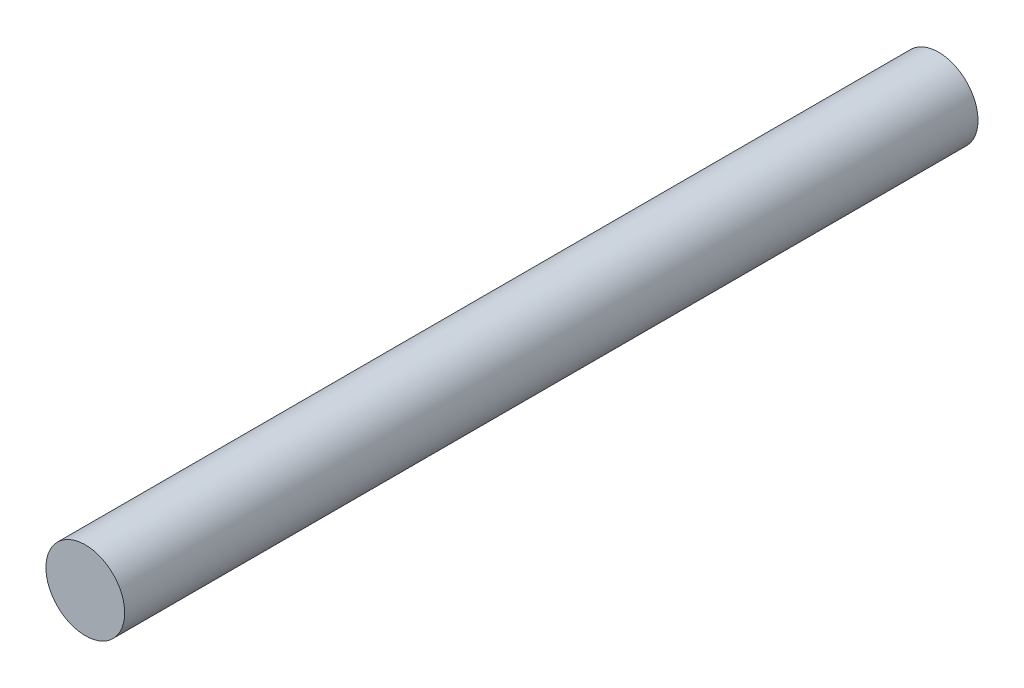
ISO-10303-21;
HEADER;
FILE_DESCRIPTION(('STEP AP214'),'2;1');
FILE_NAME('part.step','',(''),(''),'','','');
FILE_SCHEMA(('AUTOMOTIVE_DESIGN { 1 0 10303 214 1 1 1 1 }'));
ENDSEC;
DATA;
#1=APPLICATION_CONTEXT('core data for automotive mechanical design processes');
#2=APPLICATION_PROTOCOL_DEFINITION('international standard','automotive_design',2000,#1);
#3=PRODUCT_CONTEXT('',#1,'mechanical');
#4=PRODUCT('Part','Part','',(#3));
#5=PRODUCT_RELATED_PRODUCT_CATEGORY('part','',(#4));
#6=PRODUCT_DEFINITION_FORMATION('','',#4);
#7=PRODUCT_DEFINITION_CONTEXT('part definition',#1,'design');
#8=PRODUCT_DEFINITION('design','',#6,#7);
#9=PRODUCT_DEFINITION_SHAPE('','',#8);
#10=(LENGTH_UNIT() NAMED_UNIT(*) SI_UNIT(.MILLI.,.METRE.));
#11=(NAMED_UNIT(*) PLANE_ANGLE_UNIT() SI_UNIT($,.RADIAN.));
#12=(NAMED_UNIT(*) SI_UNIT($,.STERADIAN.) SOLID_ANGLE_UNIT());
#13=UNCERTAINTY_MEASURE_WITH_UNIT(LENGTH_MEASURE(1.E-05),#10,'distance_accuracy_value','');
#14=(GEOMETRIC_REPRESENTATION_CONTEXT(3) GLOBAL_UNCERTAINTY_ASSIGNED_CONTEXT((#13)) GLOBAL_UNIT_ASSIGNED_CONTEXT((#10,
#11,#12)) REPRESENTATION_CONTEXT('',''));
#15=CARTESIAN_POINT('',(0.,0.,0.));
#16=DIRECTION('',(0.,0.,1.));
#17=DIRECTION('',(1.,0.,0.));
#18=AXIS2_PLACEMENT_3D('',#15,#16,#17);
#19=CARTESIAN_POINT('',(0.,0.,65.));
#20=DIRECTION('',(0.,0.,-1.));
#21=DIRECTION('',(-1.,0.,0.));
#22=AXIS2_PLACEMENT_3D('',#19,#20,#21);
#23=CYLINDRICAL_SURFACE('',#22,3.);
#24=CARTESIAN_POINT('',(0.,0.,65.));
#25=DIRECTION('',(0.,0.,1.));
#26=DIRECTION('',(1.,0.,0.));
#27=AXIS2_PLACEMENT_3D('',#24,#25,#26);
#28=CIRCLE('',#27,3.);
#29=CARTESIAN_POINT('',(3.,0.,65.));
#30=VERTEX_POINT('',#29);
#31=EDGE_CURVE('E10',#30,#30,#28,.T.);
#32=ORIENTED_EDGE('',*,*,#31,.F.);
#33=EDGE_LOOP('',(#32));
#34=FACE_BOUND('',#33,.T.);
#35=CARTESIAN_POINT('',(0.,0.,0.));
#36=DIRECTION('',(0.,0.,1.));
#37=DIRECTION('',(1.,0.,0.));
#38=AXIS2_PLACEMENT_3D('',#35,#36,#37);
#39=CIRCLE('',#38,3.);
#40=CARTESIAN_POINT('',(3.,0.,0.));
#41=VERTEX_POINT('',#40);
#42=EDGE_CURVE('E36',#41,#41,#39,.T.);
#43=ORIENTED_EDGE('',*,*,#42,.T.);
#44=EDGE_LOOP('',(#43));
#45=FACE_BOUND('',#44,.T.);
#46=ADVANCED_FACE('F33',(#34,#45),#23,.T.);
#47=CARTESIAN_POINT('',(0.,0.,65.));
#48=DIRECTION('',(0.,0.,1.));
#49=DIRECTION('',(1.,0.,0.));
#50=AXIS2_PLACEMENT_3D('',#47,#48,#49);
#51=PLANE('',#50);
#52=ORIENTED_EDGE('',*,*,#31,.T.);
#53=EDGE_LOOP('',(#52));
#54=FACE_BOUND('',#53,.T.);
#55=ADVANCED_FACE('F48',(#54),#51,.T.);
#56=CARTESIAN_POINT('',(0.,0.,0.));
#57=DIRECTION('',(0.,0.,1.));
#58=DIRECTION('',(1.,0.,0.));
#59=AXIS2_PLACEMENT_3D('',#56,#57,#58);
#60=PLANE('',#59);
#61=ORIENTED_EDGE('',*,*,#42,.F.);
#62=EDGE_LOOP('',(#61));
#63=FACE_BOUND('',#62,.T.);
#64=ADVANCED_FACE('F46',(#63),#60,.F.);
#65=CLOSED_SHELL('',(#46,#55,#64));
#66=MANIFOLD_SOLID_BREP('B2',#65);
#67=ADVANCED_BREP_SHAPE_REPRESENTATION('',(#18,#66),#14);
#68=SHAPE_DEFINITION_REPRESENTATION(#9,#67);
ENDSEC;
END-ISO-10303-21;
